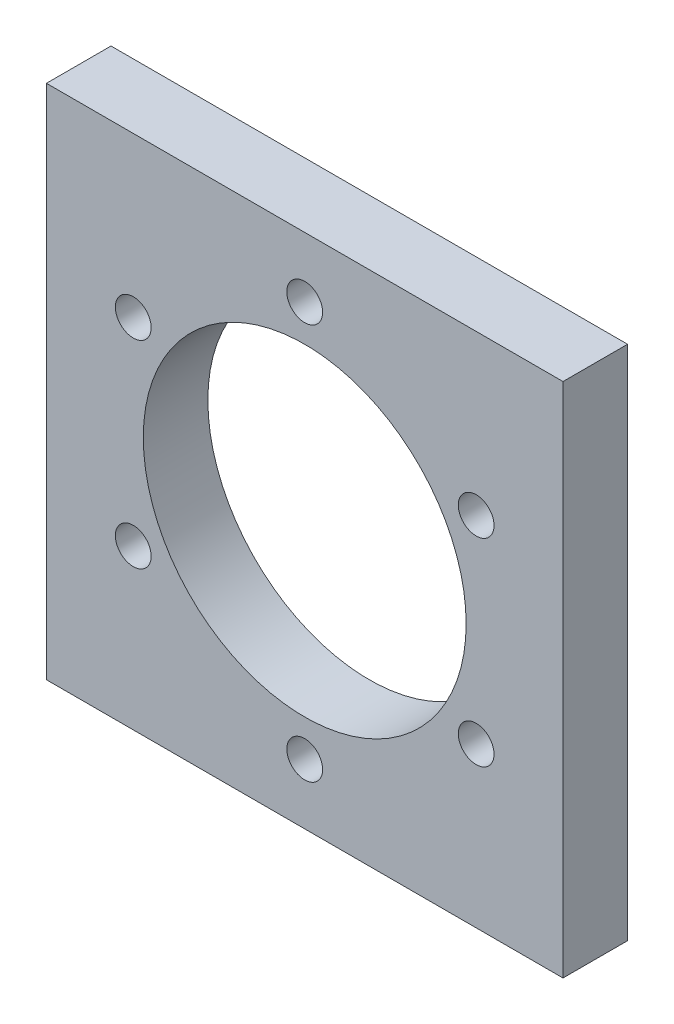
ISO-10303-21;
HEADER;
FILE_DESCRIPTION(('STEP AP214'),'2;1');
FILE_NAME('part.step','',(''),(''),'','','');
FILE_SCHEMA(('AUTOMOTIVE_DESIGN { 1 0 10303 214 1 1 1 1 }'));
ENDSEC;
DATA;
#1=APPLICATION_CONTEXT('core data for automotive mechanical design processes');
#2=APPLICATION_PROTOCOL_DEFINITION('international standard','automotive_design',2000,#1);
#3=PRODUCT_CONTEXT('',#1,'mechanical');
#4=PRODUCT('Part','Part','',(#3));
#5=PRODUCT_RELATED_PRODUCT_CATEGORY('part','',(#4));
#6=PRODUCT_DEFINITION_FORMATION('','',#4);
#7=PRODUCT_DEFINITION_CONTEXT('part definition',#1,'design');
#8=PRODUCT_DEFINITION('design','',#6,#7);
#9=PRODUCT_DEFINITION_SHAPE('','',#8);
#10=(LENGTH_UNIT() NAMED_UNIT(*) SI_UNIT(.MILLI.,.METRE.));
#11=(NAMED_UNIT(*) PLANE_ANGLE_UNIT() SI_UNIT($,.RADIAN.));
#12=(NAMED_UNIT(*) SI_UNIT($,.STERADIAN.) SOLID_ANGLE_UNIT());
#13=UNCERTAINTY_MEASURE_WITH_UNIT(LENGTH_MEASURE(1.E-05),#10,'distance_accuracy_value','');
#14=(GEOMETRIC_REPRESENTATION_CONTEXT(3) GLOBAL_UNCERTAINTY_ASSIGNED_CONTEXT((#13)) GLOBAL_UNIT_ASSIGNED_CONTEXT((#10,
#11,#12)) REPRESENTATION_CONTEXT('',''));
#15=CARTESIAN_POINT('',(0.,0.,0.));
#16=DIRECTION('',(0.,0.,1.));
#17=DIRECTION('',(1.,0.,0.));
#18=AXIS2_PLACEMENT_3D('',#15,#16,#17);
#19=CARTESIAN_POINT('',(44.7550373881983,0.,6.35));
#20=DIRECTION('',(1.,0.,0.));
#21=DIRECTION('',(0.,1.,0.));
#22=AXIS2_PLACEMENT_3D('',#19,#20,#21);
#23=PLANE('',#22);
#24=DIRECTION('',(0.,-1.,0.));
#25=VECTOR('',#24,1.);
#26=CARTESIAN_POINT('',(44.7550373881983,0.,0.));
#27=LINE('',#26,#25);
#28=CARTESIAN_POINT('',(44.7550373881983,49.4950465444918,0.));
#29=VERTEX_POINT('',#28);
#30=CARTESIAN_POINT('',(44.7550373881983,-1.30495345550823,0.));
#31=VERTEX_POINT('',#30);
#32=EDGE_CURVE('E143',#29,#31,#27,.T.);
#33=ORIENTED_EDGE('',*,*,#32,.F.);
#34=DIRECTION('',(0.,0.,-1.));
#35=VECTOR('',#34,1.);
#36=CARTESIAN_POINT('',(44.7550373881983,49.4950465444918,6.35));
#37=LINE('',#36,#35);
#38=CARTESIAN_POINT('',(44.7550373881983,49.4950465444918,6.35));
#39=VERTEX_POINT('',#38);
#40=EDGE_CURVE('E11',#39,#29,#37,.T.);
#41=ORIENTED_EDGE('',*,*,#40,.F.);
#42=DIRECTION('',(0.,-1.,0.));
#43=VECTOR('',#42,1.);
#44=CARTESIAN_POINT('',(44.7550373881983,0.,6.35));
#45=LINE('',#44,#43);
#46=CARTESIAN_POINT('',(44.7550373881983,-1.30495345550823,6.35));
#47=VERTEX_POINT('',#46);
#48=EDGE_CURVE('E105',#39,#47,#45,.T.);
#49=ORIENTED_EDGE('',*,*,#48,.T.);
#50=DIRECTION('',(0.,0.,-1.));
#51=VECTOR('',#50,1.);
#52=CARTESIAN_POINT('',(44.7550373881983,-1.30495345550823,6.35));
#53=LINE('',#52,#51);
#54=EDGE_CURVE('E82',#47,#31,#53,.T.);
#55=ORIENTED_EDGE('',*,*,#54,.T.);
#56=EDGE_LOOP('',(#33,#41,#49,#55));
#57=FACE_BOUND('',#56,.T.);
#58=ADVANCED_FACE('F41',(#57),#23,.T.);
#59=CARTESIAN_POINT('',(0.,49.4950465444918,6.35));
#60=DIRECTION('',(0.,1.,0.));
#61=DIRECTION('',(0.,0.,1.));
#62=AXIS2_PLACEMENT_3D('',#59,#60,#61);
#63=PLANE('',#62);
#64=DIRECTION('',(1.,0.,0.));
#65=VECTOR('',#64,1.);
#66=CARTESIAN_POINT('',(0.,49.4950465444918,0.));
#67=LINE('',#66,#65);
#68=CARTESIAN_POINT('',(-6.04496261180167,49.4950465444918,0.));
#69=VERTEX_POINT('',#68);
#70=EDGE_CURVE('E94',#69,#29,#67,.T.);
#71=ORIENTED_EDGE('',*,*,#70,.F.);
#72=DIRECTION('',(0.,0.,-1.));
#73=VECTOR('',#72,1.);
#74=CARTESIAN_POINT('',(-6.04496261180167,49.4950465444918,6.35));
#75=LINE('',#74,#73);
#76=CARTESIAN_POINT('',(-6.04496261180167,49.4950465444918,6.35));
#77=VERTEX_POINT('',#76);
#78=EDGE_CURVE('E51',#77,#69,#75,.T.);
#79=ORIENTED_EDGE('',*,*,#78,.F.);
#80=DIRECTION('',(1.,0.,0.));
#81=VECTOR('',#80,1.);
#82=CARTESIAN_POINT('',(0.,49.4950465444918,6.35));
#83=LINE('',#82,#81);
#84=EDGE_CURVE('E92',#77,#39,#83,.T.);
#85=ORIENTED_EDGE('',*,*,#84,.T.);
#86=ORIENTED_EDGE('',*,*,#40,.T.);
#87=EDGE_LOOP('',(#71,#79,#85,#86));
#88=FACE_BOUND('',#87,.T.);
#89=ADVANCED_FACE('F90',(#88),#63,.T.);
#90=CARTESIAN_POINT('',(-6.04496261180166,0.,6.35));
#91=DIRECTION('',(1.,0.,0.));
#92=DIRECTION('',(0.,1.,0.));
#93=AXIS2_PLACEMENT_3D('',#90,#91,#92);
#94=PLANE('',#93);
#95=DIRECTION('',(0.,-1.,0.));
#96=VECTOR('',#95,1.);
#97=CARTESIAN_POINT('',(-6.04496261180166,0.,0.));
#98=LINE('',#97,#96);
#99=CARTESIAN_POINT('',(-6.04496261180166,-1.30495345550823,0.));
#100=VERTEX_POINT('',#99);
#101=EDGE_CURVE('E148',#69,#100,#98,.T.);
#102=ORIENTED_EDGE('',*,*,#101,.T.);
#103=DIRECTION('',(0.,0.,-1.));
#104=VECTOR('',#103,1.);
#105=CARTESIAN_POINT('',(-6.04496261180166,-1.30495345550823,6.35));
#106=LINE('',#105,#104);
#107=CARTESIAN_POINT('',(-6.04496261180166,-1.30495345550823,6.35));
#108=VERTEX_POINT('',#107);
#109=EDGE_CURVE('E98',#108,#100,#106,.T.);
#110=ORIENTED_EDGE('',*,*,#109,.F.);
#111=DIRECTION('',(0.,-1.,0.));
#112=VECTOR('',#111,1.);
#113=CARTESIAN_POINT('',(-6.04496261180166,0.,6.35));
#114=LINE('',#113,#112);
#115=EDGE_CURVE('E100',#77,#108,#114,.T.);
#116=ORIENTED_EDGE('',*,*,#115,.F.);
#117=ORIENTED_EDGE('',*,*,#78,.T.);
#118=EDGE_LOOP('',(#102,#110,#116,#117));
#119=FACE_BOUND('',#118,.T.);
#120=ADVANCED_FACE('F101',(#119),#94,.F.);
#121=CARTESIAN_POINT('',(2.49426869940321,14.3604772032721,6.35));
#122=DIRECTION('',(0.,0.,-1.));
#123=DIRECTION('',(-1.,0.,0.));
#124=AXIS2_PLACEMENT_3D('',#121,#122,#123);
#125=CYLINDRICAL_SURFACE('',#124,1.76001013689255);
#126=CARTESIAN_POINT('',(2.49426869940321,14.3604772032721,6.35));
#127=DIRECTION('',(0.,0.,1.));
#128=DIRECTION('',(1.,0.,0.));
#129=AXIS2_PLACEMENT_3D('',#126,#127,#128);
#130=CIRCLE('',#129,1.76001013689255);
#131=CARTESIAN_POINT('',(4.25427883629576,14.3604772032721,6.35));
#132=VERTEX_POINT('',#131);
#133=EDGE_CURVE('E109',#132,#132,#130,.T.);
#134=ORIENTED_EDGE('',*,*,#133,.T.);
#135=EDGE_LOOP('',(#134));
#136=FACE_BOUND('',#135,.T.);
#137=CARTESIAN_POINT('',(2.49426869940321,14.3604772032721,0.));
#138=DIRECTION('',(0.,0.,1.));
#139=DIRECTION('',(1.,0.,0.));
#140=AXIS2_PLACEMENT_3D('',#137,#138,#139);
#141=CIRCLE('',#140,1.76001013689255);
#142=CARTESIAN_POINT('',(4.25427883629576,14.3604772032721,0.));
#143=VERTEX_POINT('',#142);
#144=EDGE_CURVE('E139',#143,#143,#141,.T.);
#145=ORIENTED_EDGE('',*,*,#144,.F.);
#146=EDGE_LOOP('',(#145));
#147=FACE_BOUND('',#146,.T.);
#148=ADVANCED_FACE('F168',(#136,#147),#125,.F.);
#149=CARTESIAN_POINT('',(2.49426869940342,33.8296158857118,6.35));
#150=DIRECTION('',(0.,0.,-1.));
#151=DIRECTION('',(-1.,0.,0.));
#152=AXIS2_PLACEMENT_3D('',#149,#150,#151);
#153=CYLINDRICAL_SURFACE('',#152,1.76001013689255);
#154=CARTESIAN_POINT('',(2.49426869940342,33.8296158857118,6.35));
#155=DIRECTION('',(0.,0.,1.));
#156=DIRECTION('',(1.,0.,0.));
#157=AXIS2_PLACEMENT_3D('',#154,#155,#156);
#158=CIRCLE('',#157,1.76001013689255);
#159=CARTESIAN_POINT('',(4.25427883629597,33.8296158857118,6.35));
#160=VERTEX_POINT('',#159);
#161=EDGE_CURVE('E337',#160,#160,#158,.T.);
#162=ORIENTED_EDGE('',*,*,#161,.T.);
#163=EDGE_LOOP('',(#162));
#164=FACE_BOUND('',#163,.T.);
#165=CARTESIAN_POINT('',(2.49426869940342,33.8296158857118,0.));
#166=DIRECTION('',(0.,0.,1.));
#167=DIRECTION('',(1.,0.,0.));
#168=AXIS2_PLACEMENT_3D('',#165,#166,#167);
#169=CIRCLE('',#168,1.76001013689255);
#170=CARTESIAN_POINT('',(4.25427883629597,33.8296158857118,0.));
#171=VERTEX_POINT('',#170);
#172=EDGE_CURVE('E135',#171,#171,#169,.T.);
#173=ORIENTED_EDGE('',*,*,#172,.F.);
#174=EDGE_LOOP('',(#173));
#175=FACE_BOUND('',#174,.T.);
#176=ADVANCED_FACE('F171',(#164,#175),#153,.F.);
#177=CARTESIAN_POINT('',(36.2158060769934,33.8296158857116,6.35));
#178=DIRECTION('',(0.,0.,-1.));
#179=DIRECTION('',(-1.,0.,0.));
#180=AXIS2_PLACEMENT_3D('',#177,#178,#179);
#181=CYLINDRICAL_SURFACE('',#180,1.76001013689255);
#182=CARTESIAN_POINT('',(36.2158060769934,33.8296158857116,6.35));
#183=DIRECTION('',(0.,0.,1.));
#184=DIRECTION('',(1.,0.,0.));
#185=AXIS2_PLACEMENT_3D('',#182,#183,#184);
#186=CIRCLE('',#185,1.76001013689255);
#187=CARTESIAN_POINT('',(37.9758162138859,33.8296158857116,6.35));
#188=VERTEX_POINT('',#187);
#189=EDGE_CURVE('E333',#188,#188,#186,.T.);
#190=ORIENTED_EDGE('',*,*,#189,.T.);
#191=EDGE_LOOP('',(#190));
#192=FACE_BOUND('',#191,.T.);
#193=CARTESIAN_POINT('',(36.2158060769934,33.8296158857116,0.));
#194=DIRECTION('',(0.,0.,1.));
#195=DIRECTION('',(1.,0.,0.));
#196=AXIS2_PLACEMENT_3D('',#193,#194,#195);
#197=CIRCLE('',#196,1.76001013689255);
#198=CARTESIAN_POINT('',(37.9758162138859,33.8296158857116,0.));
#199=VERTEX_POINT('',#198);
#200=EDGE_CURVE('E131',#199,#199,#197,.T.);
#201=ORIENTED_EDGE('',*,*,#200,.F.);
#202=EDGE_LOOP('',(#201));
#203=FACE_BOUND('',#202,.T.);
#204=ADVANCED_FACE('F175',(#192,#203),#181,.F.);
#205=CARTESIAN_POINT('',(19.3550373881983,43.5641852269314,6.35));
#206=DIRECTION('',(0.,0.,-1.));
#207=DIRECTION('',(-1.,0.,0.));
#208=AXIS2_PLACEMENT_3D('',#205,#206,#207);
#209=CYLINDRICAL_SURFACE('',#208,1.76001013689254);
#210=CARTESIAN_POINT('',(19.3550373881983,43.5641852269314,6.35));
#211=DIRECTION('',(0.,0.,1.));
#212=DIRECTION('',(1.,0.,0.));
#213=AXIS2_PLACEMENT_3D('',#210,#211,#212);
#214=CIRCLE('',#213,1.76001013689254);
#215=CARTESIAN_POINT('',(21.1150475250909,43.5641852269314,6.35));
#216=VERTEX_POINT('',#215);
#217=EDGE_CURVE('E329',#216,#216,#214,.T.);
#218=ORIENTED_EDGE('',*,*,#217,.T.);
#219=EDGE_LOOP('',(#218));
#220=FACE_BOUND('',#219,.T.);
#221=CARTESIAN_POINT('',(19.3550373881983,43.5641852269314,0.));
#222=DIRECTION('',(0.,0.,1.));
#223=DIRECTION('',(1.,0.,0.));
#224=AXIS2_PLACEMENT_3D('',#221,#222,#223);
#225=CIRCLE('',#224,1.76001013689254);
#226=CARTESIAN_POINT('',(21.1150475250909,43.5641852269314,0.));
#227=VERTEX_POINT('',#226);
#228=EDGE_CURVE('E127',#227,#227,#225,.T.);
#229=ORIENTED_EDGE('',*,*,#228,.F.);
#230=EDGE_LOOP('',(#229));
#231=FACE_BOUND('',#230,.T.);
#232=ADVANCED_FACE('F179',(#220,#231),#209,.F.);
#233=CARTESIAN_POINT('',(19.3550373881983,4.62590786205212,6.35));
#234=DIRECTION('',(0.,0.,-1.));
#235=DIRECTION('',(-1.,0.,0.));
#236=AXIS2_PLACEMENT_3D('',#233,#234,#235);
#237=CYLINDRICAL_SURFACE('',#236,1.76001013689254);
#238=CARTESIAN_POINT('',(19.3550373881983,4.62590786205212,6.35));
#239=DIRECTION('',(0.,0.,1.));
#240=DIRECTION('',(1.,0.,0.));
#241=AXIS2_PLACEMENT_3D('',#238,#239,#240);
#242=CIRCLE('',#241,1.76001013689254);
#243=CARTESIAN_POINT('',(21.1150475250909,4.62590786205212,6.35));
#244=VERTEX_POINT('',#243);
#245=EDGE_CURVE('E325',#244,#244,#242,.T.);
#246=ORIENTED_EDGE('',*,*,#245,.T.);
#247=EDGE_LOOP('',(#246));
#248=FACE_BOUND('',#247,.T.);
#249=CARTESIAN_POINT('',(19.3550373881983,4.62590786205212,0.));
#250=DIRECTION('',(0.,0.,1.));
#251=DIRECTION('',(1.,0.,0.));
#252=AXIS2_PLACEMENT_3D('',#249,#250,#251);
#253=CIRCLE('',#252,1.76001013689254);
#254=CARTESIAN_POINT('',(21.1150475250909,4.62590786205212,0.));
#255=VERTEX_POINT('',#254);
#256=EDGE_CURVE('E123',#255,#255,#253,.T.);
#257=ORIENTED_EDGE('',*,*,#256,.F.);
#258=EDGE_LOOP('',(#257));
#259=FACE_BOUND('',#258,.T.);
#260=ADVANCED_FACE('F183',(#248,#259),#237,.F.);
#261=CARTESIAN_POINT('',(36.2158060769933,14.3604772032719,6.35));
#262=DIRECTION('',(0.,0.,-1.));
#263=DIRECTION('',(-1.,0.,0.));
#264=AXIS2_PLACEMENT_3D('',#261,#262,#263);
#265=CYLINDRICAL_SURFACE('',#264,1.76001013689255);
#266=CARTESIAN_POINT('',(36.2158060769933,14.3604772032719,6.35));
#267=DIRECTION('',(0.,0.,1.));
#268=DIRECTION('',(1.,0.,0.));
#269=AXIS2_PLACEMENT_3D('',#266,#267,#268);
#270=CIRCLE('',#269,1.76001013689255);
#271=CARTESIAN_POINT('',(37.9758162138859,14.3604772032719,6.35));
#272=VERTEX_POINT('',#271);
#273=EDGE_CURVE('E197',#272,#272,#270,.T.);
#274=ORIENTED_EDGE('',*,*,#273,.T.);
#275=EDGE_LOOP('',(#274));
#276=FACE_BOUND('',#275,.T.);
#277=CARTESIAN_POINT('',(36.2158060769933,14.3604772032719,0.));
#278=DIRECTION('',(0.,0.,1.));
#279=DIRECTION('',(1.,0.,0.));
#280=AXIS2_PLACEMENT_3D('',#277,#278,#279);
#281=CIRCLE('',#280,1.76001013689255);
#282=CARTESIAN_POINT('',(37.9758162138859,14.3604772032719,0.));
#283=VERTEX_POINT('',#282);
#284=EDGE_CURVE('E119',#283,#283,#281,.T.);
#285=ORIENTED_EDGE('',*,*,#284,.F.);
#286=EDGE_LOOP('',(#285));
#287=FACE_BOUND('',#286,.T.);
#288=ADVANCED_FACE('F186',(#276,#287),#265,.F.);
#289=CARTESIAN_POINT('',(19.3550373881983,24.0950465444918,6.35));
#290=DIRECTION('',(0.,0.,-1.));
#291=DIRECTION('',(-1.,0.,0.));
#292=AXIS2_PLACEMENT_3D('',#289,#290,#291);
#293=CYLINDRICAL_SURFACE('',#292,15.875);
#294=CARTESIAN_POINT('',(19.3550373881983,24.0950465444918,6.35));
#295=DIRECTION('',(0.,0.,1.));
#296=DIRECTION('',(1.,0.,0.));
#297=AXIS2_PLACEMENT_3D('',#294,#295,#296);
#298=CIRCLE('',#297,15.875);
#299=CARTESIAN_POINT('',(35.2300373881983,24.0950465444918,6.35));
#300=VERTEX_POINT('',#299);
#301=EDGE_CURVE('E153',#300,#300,#298,.T.);
#302=ORIENTED_EDGE('',*,*,#301,.T.);
#303=EDGE_LOOP('',(#302));
#304=FACE_BOUND('',#303,.T.);
#305=CARTESIAN_POINT('',(19.3550373881983,24.0950465444918,0.));
#306=DIRECTION('',(0.,0.,1.));
#307=DIRECTION('',(1.,0.,0.));
#308=AXIS2_PLACEMENT_3D('',#305,#306,#307);
#309=CIRCLE('',#308,15.875);
#310=CARTESIAN_POINT('',(35.2300373881983,24.0950465444918,0.));
#311=VERTEX_POINT('',#310);
#312=EDGE_CURVE('E115',#311,#311,#309,.T.);
#313=ORIENTED_EDGE('',*,*,#312,.F.);
#314=EDGE_LOOP('',(#313));
#315=FACE_BOUND('',#314,.T.);
#316=ADVANCED_FACE('F43',(#304,#315),#293,.F.);
#317=CARTESIAN_POINT('',(0.,-1.30495345550823,6.35));
#318=DIRECTION('',(0.,1.,0.));
#319=DIRECTION('',(0.,0.,1.));
#320=AXIS2_PLACEMENT_3D('',#317,#318,#319);
#321=PLANE('',#320);
#322=DIRECTION('',(1.,0.,0.));
#323=VECTOR('',#322,1.);
#324=CARTESIAN_POINT('',(0.,-1.30495345550823,0.));
#325=LINE('',#324,#323);
#326=EDGE_CURVE('E75',#100,#31,#325,.T.);
#327=ORIENTED_EDGE('',*,*,#326,.T.);
#328=ORIENTED_EDGE('',*,*,#54,.F.);
#329=DIRECTION('',(1.,0.,0.));
#330=VECTOR('',#329,1.);
#331=CARTESIAN_POINT('',(0.,-1.30495345550823,6.35));
#332=LINE('',#331,#330);
#333=EDGE_CURVE('E59',#108,#47,#332,.T.);
#334=ORIENTED_EDGE('',*,*,#333,.F.);
#335=ORIENTED_EDGE('',*,*,#109,.T.);
#336=EDGE_LOOP('',(#327,#328,#334,#335));
#337=FACE_BOUND('',#336,.T.);
#338=ADVANCED_FACE('F158',(#337),#321,.F.);
#339=CARTESIAN_POINT('',(0.,0.,6.35));
#340=DIRECTION('',(0.,0.,1.));
#341=DIRECTION('',(1.,0.,0.));
#342=AXIS2_PLACEMENT_3D('',#339,#340,#341);
#343=PLANE('',#342);
#344=ORIENTED_EDGE('',*,*,#301,.F.);
#345=EDGE_LOOP('',(#344));
#346=FACE_BOUND('',#345,.T.);
#347=ORIENTED_EDGE('',*,*,#273,.F.);
#348=EDGE_LOOP('',(#347));
#349=FACE_BOUND('',#348,.T.);
#350=ORIENTED_EDGE('',*,*,#245,.F.);
#351=EDGE_LOOP('',(#350));
#352=FACE_BOUND('',#351,.T.);
#353=ORIENTED_EDGE('',*,*,#217,.F.);
#354=EDGE_LOOP('',(#353));
#355=FACE_BOUND('',#354,.T.);
#356=ORIENTED_EDGE('',*,*,#189,.F.);
#357=EDGE_LOOP('',(#356));
#358=FACE_BOUND('',#357,.T.);
#359=ORIENTED_EDGE('',*,*,#161,.F.);
#360=EDGE_LOOP('',(#359));
#361=FACE_BOUND('',#360,.T.);
#362=ORIENTED_EDGE('',*,*,#133,.F.);
#363=EDGE_LOOP('',(#362));
#364=FACE_BOUND('',#363,.T.);
#365=ORIENTED_EDGE('',*,*,#48,.F.);
#366=ORIENTED_EDGE('',*,*,#84,.F.);
#367=ORIENTED_EDGE('',*,*,#115,.T.);
#368=ORIENTED_EDGE('',*,*,#333,.T.);
#369=EDGE_LOOP('',(#365,#366,#367,#368));
#370=FACE_BOUND('',#369,.T.);
#371=ADVANCED_FACE('F104',(#346,#349,#352,#355,#358,#361,#364,#370),#343,.T.);
#372=CARTESIAN_POINT('',(0.,0.,0.));
#373=DIRECTION('',(0.,0.,1.));
#374=DIRECTION('',(1.,0.,0.));
#375=AXIS2_PLACEMENT_3D('',#372,#373,#374);
#376=PLANE('',#375);
#377=ORIENTED_EDGE('',*,*,#312,.T.);
#378=EDGE_LOOP('',(#377));
#379=FACE_BOUND('',#378,.T.);
#380=ORIENTED_EDGE('',*,*,#284,.T.);
#381=EDGE_LOOP('',(#380));
#382=FACE_BOUND('',#381,.T.);
#383=ORIENTED_EDGE('',*,*,#256,.T.);
#384=EDGE_LOOP('',(#383));
#385=FACE_BOUND('',#384,.T.);
#386=ORIENTED_EDGE('',*,*,#228,.T.);
#387=EDGE_LOOP('',(#386));
#388=FACE_BOUND('',#387,.T.);
#389=ORIENTED_EDGE('',*,*,#200,.T.);
#390=EDGE_LOOP('',(#389));
#391=FACE_BOUND('',#390,.T.);
#392=ORIENTED_EDGE('',*,*,#172,.T.);
#393=EDGE_LOOP('',(#392));
#394=FACE_BOUND('',#393,.T.);
#395=ORIENTED_EDGE('',*,*,#144,.T.);
#396=EDGE_LOOP('',(#395));
#397=FACE_BOUND('',#396,.T.);
#398=ORIENTED_EDGE('',*,*,#32,.T.);
#399=ORIENTED_EDGE('',*,*,#326,.F.);
#400=ORIENTED_EDGE('',*,*,#101,.F.);
#401=ORIENTED_EDGE('',*,*,#70,.T.);
#402=EDGE_LOOP('',(#398,#399,#400,#401));
#403=FACE_BOUND('',#402,.T.);
#404=ADVANCED_FACE('F159',(#379,#382,#385,#388,#391,#394,#397,#403),#376,.F.);
#405=CLOSED_SHELL('',(#58,#89,#120,#148,#176,#204,#232,#260,#288,#316,#338,#371,#404));
#406=MANIFOLD_SOLID_BREP('B2',#405);
#407=ADVANCED_BREP_SHAPE_REPRESENTATION('',(#18,#406),#14);
#408=SHAPE_DEFINITION_REPRESENTATION(#9,#407);
ENDSEC;
END-ISO-10303-21;
